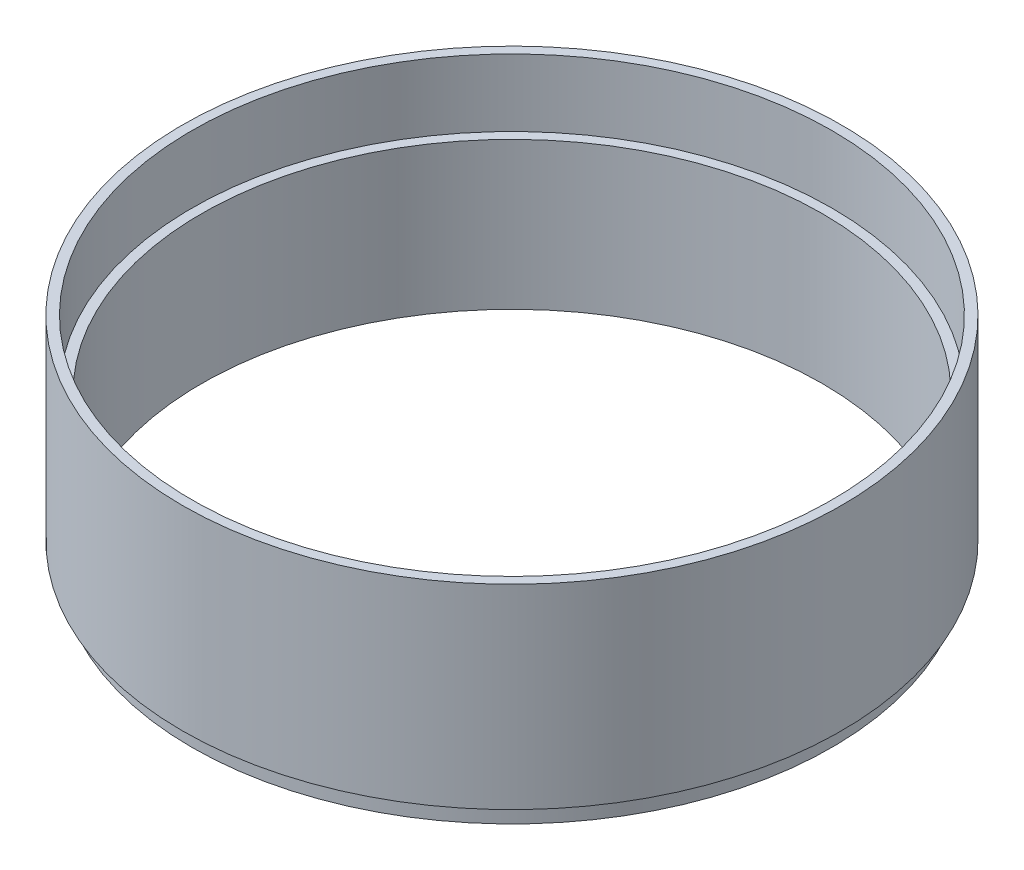
ISO-10303-21;
HEADER;
FILE_DESCRIPTION(('STEP AP214'),'2;1');
FILE_NAME('part.step','',(''),(''),'','','');
FILE_SCHEMA(('AUTOMOTIVE_DESIGN { 1 0 10303 214 1 1 1 1 }'));
ENDSEC;
DATA;
#1=APPLICATION_CONTEXT('core data for automotive mechanical design processes');
#2=APPLICATION_PROTOCOL_DEFINITION('international standard','automotive_design',2000,#1);
#3=PRODUCT_CONTEXT('',#1,'mechanical');
#4=PRODUCT('Part','Part','',(#3));
#5=PRODUCT_RELATED_PRODUCT_CATEGORY('part','',(#4));
#6=PRODUCT_DEFINITION_FORMATION('','',#4);
#7=PRODUCT_DEFINITION_CONTEXT('part definition',#1,'design');
#8=PRODUCT_DEFINITION('design','',#6,#7);
#9=PRODUCT_DEFINITION_SHAPE('','',#8);
#10=(LENGTH_UNIT() NAMED_UNIT(*) SI_UNIT(.MILLI.,.METRE.));
#11=(NAMED_UNIT(*) PLANE_ANGLE_UNIT() SI_UNIT($,.RADIAN.));
#12=(NAMED_UNIT(*) SI_UNIT($,.STERADIAN.) SOLID_ANGLE_UNIT());
#13=UNCERTAINTY_MEASURE_WITH_UNIT(LENGTH_MEASURE(1.E-05),#10,'distance_accuracy_value','');
#14=(GEOMETRIC_REPRESENTATION_CONTEXT(3) GLOBAL_UNCERTAINTY_ASSIGNED_CONTEXT((#13)) GLOBAL_UNIT_ASSIGNED_CONTEXT((#10,
#11,#12)) REPRESENTATION_CONTEXT('',''));
#15=CARTESIAN_POINT('',(0.,0.,0.));
#16=DIRECTION('',(0.,0.,1.));
#17=DIRECTION('',(1.,0.,0.));
#18=AXIS2_PLACEMENT_3D('',#15,#16,#17);
#19=CARTESIAN_POINT('',(0.,46.,0.));
#20=DIRECTION('',(0.,1.,0.));
#21=DIRECTION('',(0.,0.,1.));
#22=AXIS2_PLACEMENT_3D('',#19,#20,#21);
#23=PLANE('',#22);
#24=CARTESIAN_POINT('',(0.,46.,0.));
#25=DIRECTION('',(0.,1.,0.));
#26=DIRECTION('',(0.,0.,1.));
#27=AXIS2_PLACEMENT_3D('',#24,#25,#26);
#28=CIRCLE('',#27,97.);
#29=CARTESIAN_POINT('',(0.,46.,97.));
#30=VERTEX_POINT('',#29);
#31=EDGE_CURVE('E65',#30,#30,#28,.T.);
#32=ORIENTED_EDGE('',*,*,#31,.F.);
#33=EDGE_LOOP('',(#32));
#34=FACE_BOUND('',#33,.T.);
#35=CARTESIAN_POINT('',(0.,46.,0.));
#36=DIRECTION('',(0.,1.,0.));
#37=DIRECTION('',(0.,0.,1.));
#38=AXIS2_PLACEMENT_3D('',#35,#36,#37);
#39=CIRCLE('',#38,100.);
#40=CARTESIAN_POINT('',(0.,46.,-100.));
#41=VERTEX_POINT('',#40);
#42=EDGE_CURVE('E74',#41,#41,#39,.T.);
#43=ORIENTED_EDGE('',*,*,#42,.T.);
#44=EDGE_LOOP('',(#43));
#45=FACE_BOUND('',#44,.T.);
#46=ADVANCED_FACE('F43',(#34,#45),#23,.T.);
#47=CARTESIAN_POINT('',(0.,0.,0.));
#48=DIRECTION('',(0.,1.,0.));
#49=DIRECTION('',(0.,0.,1.));
#50=AXIS2_PLACEMENT_3D('',#47,#48,#49);
#51=PLANE('',#50);
#52=CARTESIAN_POINT('',(0.,0.,0.));
#53=DIRECTION('',(0.,1.,0.));
#54=DIRECTION('',(0.,0.,1.));
#55=AXIS2_PLACEMENT_3D('',#52,#53,#54);
#56=CIRCLE('',#55,100.);
#57=CARTESIAN_POINT('',(0.,0.,100.));
#58=VERTEX_POINT('',#57);
#59=EDGE_CURVE('E47',#58,#58,#56,.T.);
#60=ORIENTED_EDGE('',*,*,#59,.F.);
#61=EDGE_LOOP('',(#60));
#62=FACE_BOUND('',#61,.T.);
#63=CARTESIAN_POINT('',(0.,0.,0.));
#64=DIRECTION('',(0.,1.,0.));
#65=DIRECTION('',(0.,0.,1.));
#66=AXIS2_PLACEMENT_3D('',#63,#64,#65);
#67=CIRCLE('',#66,97.);
#68=CARTESIAN_POINT('',(0.,0.,97.));
#69=VERTEX_POINT('',#68);
#70=EDGE_CURVE('E56',#69,#69,#67,.T.);
#71=ORIENTED_EDGE('',*,*,#70,.T.);
#72=EDGE_LOOP('',(#71));
#73=FACE_BOUND('',#72,.T.);
#74=ADVANCED_FACE('F100',(#62,#73),#51,.F.);
#75=CARTESIAN_POINT('',(0.,6.,0.));
#76=DIRECTION('',(0.,-1.,0.));
#77=DIRECTION('',(0.,0.,-1.));
#78=AXIS2_PLACEMENT_3D('',#75,#76,#77);
#79=CYLINDRICAL_SURFACE('',#78,100.);
#80=CARTESIAN_POINT('',(0.,6.,0.));
#81=DIRECTION('',(0.,1.,0.));
#82=DIRECTION('',(0.,0.,1.));
#83=AXIS2_PLACEMENT_3D('',#80,#81,#82);
#84=CIRCLE('',#83,100.);
#85=CARTESIAN_POINT('',(0.,6.,100.));
#86=VERTEX_POINT('',#85);
#87=EDGE_CURVE('E10',#86,#86,#84,.T.);
#88=ORIENTED_EDGE('',*,*,#87,.F.);
#89=EDGE_LOOP('',(#88));
#90=FACE_BOUND('',#89,.T.);
#91=ORIENTED_EDGE('',*,*,#59,.T.);
#92=EDGE_LOOP('',(#91));
#93=FACE_BOUND('',#92,.T.);
#94=ADVANCED_FACE('F45',(#90,#93),#79,.T.);
#95=CARTESIAN_POINT('',(0.,6.,0.));
#96=DIRECTION('',(0.,-1.,0.));
#97=DIRECTION('',(0.,0.,-1.));
#98=AXIS2_PLACEMENT_3D('',#95,#96,#97);
#99=CYLINDRICAL_SURFACE('',#98,97.);
#100=ORIENTED_EDGE('',*,*,#70,.F.);
#101=EDGE_LOOP('',(#100));
#102=FACE_BOUND('',#101,.T.);
#103=ORIENTED_EDGE('',*,*,#31,.T.);
#104=EDGE_LOOP('',(#103));
#105=FACE_BOUND('',#104,.T.);
#106=ADVANCED_FACE('F110',(#102,#105),#99,.F.);
#107=CARTESIAN_POINT('',(0.,6.,0.));
#108=DIRECTION('',(0.,1.,0.));
#109=DIRECTION('',(0.,0.,1.));
#110=AXIS2_PLACEMENT_3D('',#107,#108,#109);
#111=PLANE('',#110);
#112=ORIENTED_EDGE('',*,*,#87,.T.);
#113=EDGE_LOOP('',(#112));
#114=FACE_BOUND('',#113,.T.);
#115=CARTESIAN_POINT('',(0.,6.,0.));
#116=DIRECTION('',(0.,1.,0.));
#117=DIRECTION('',(0.,0.,1.));
#118=AXIS2_PLACEMENT_3D('',#115,#116,#117);
#119=CIRCLE('',#118,103.);
#120=CARTESIAN_POINT('',(0.,6.,103.));
#121=VERTEX_POINT('',#120);
#122=EDGE_CURVE('E61',#121,#121,#119,.T.);
#123=ORIENTED_EDGE('',*,*,#122,.F.);
#124=EDGE_LOOP('',(#123));
#125=FACE_BOUND('',#124,.T.);
#126=ADVANCED_FACE('F95',(#114,#125),#111,.F.);
#127=CARTESIAN_POINT('',(0.,46.,0.));
#128=DIRECTION('',(0.,-1.,0.));
#129=DIRECTION('',(0.,0.,-1.));
#130=AXIS2_PLACEMENT_3D('',#127,#128,#129);
#131=CYLINDRICAL_SURFACE('',#130,103.);
#132=ORIENTED_EDGE('',*,*,#122,.T.);
#133=EDGE_LOOP('',(#132));
#134=FACE_BOUND('',#133,.T.);
#135=CARTESIAN_POINT('',(0.,67.,0.));
#136=DIRECTION('',(0.,1.,0.));
#137=DIRECTION('',(0.,0.,1.));
#138=AXIS2_PLACEMENT_3D('',#135,#136,#137);
#139=CIRCLE('',#138,103.);
#140=CARTESIAN_POINT('',(0.,67.,103.));
#141=VERTEX_POINT('',#140);
#142=EDGE_CURVE('E69',#141,#141,#139,.T.);
#143=ORIENTED_EDGE('',*,*,#142,.F.);
#144=EDGE_LOOP('',(#143));
#145=FACE_BOUND('',#144,.T.);
#146=ADVANCED_FACE('F87',(#134,#145),#131,.T.);
#147=CARTESIAN_POINT('',(0.,67.,0.));
#148=DIRECTION('',(0.,1.,0.));
#149=DIRECTION('',(0.,0.,1.));
#150=AXIS2_PLACEMENT_3D('',#147,#148,#149);
#151=PLANE('',#150);
#152=ORIENTED_EDGE('',*,*,#142,.T.);
#153=EDGE_LOOP('',(#152));
#154=FACE_BOUND('',#153,.T.);
#155=CARTESIAN_POINT('',(0.,67.,0.));
#156=DIRECTION('',(0.,1.,0.));
#157=DIRECTION('',(0.,0.,1.));
#158=AXIS2_PLACEMENT_3D('',#155,#156,#157);
#159=CIRCLE('',#158,100.);
#160=CARTESIAN_POINT('',(0.,67.,-100.));
#161=VERTEX_POINT('',#160);
#162=EDGE_CURVE('E73',#161,#161,#159,.T.);
#163=ORIENTED_EDGE('',*,*,#162,.F.);
#164=EDGE_LOOP('',(#163));
#165=FACE_BOUND('',#164,.T.);
#166=ADVANCED_FACE('F85',(#154,#165),#151,.T.);
#167=CARTESIAN_POINT('',(0.,67.,0.));
#168=DIRECTION('',(0.,-1.,0.));
#169=DIRECTION('',(0.,0.,-1.));
#170=AXIS2_PLACEMENT_3D('',#167,#168,#169);
#171=CYLINDRICAL_SURFACE('',#170,100.);
#172=CARTESIAN_POINT('',(0.,67.,-100.));
#173=CARTESIAN_POINT('',(0.,66.78125,-100.));
#174=CARTESIAN_POINT('',(0.,66.5625,-100.));
#175=CARTESIAN_POINT('',(0.,66.125,-100.));
#176=CARTESIAN_POINT('',(0.,65.90625,-100.));
#177=CARTESIAN_POINT('',(0.,65.46875,-100.));
#178=CARTESIAN_POINT('',(0.,65.25,-100.));
#179=CARTESIAN_POINT('',(0.,64.8125,-100.));
#180=CARTESIAN_POINT('',(0.,64.59375,-100.));
#181=CARTESIAN_POINT('',(0.,64.15625,-100.));
#182=CARTESIAN_POINT('',(0.,63.9375,-100.));
#183=CARTESIAN_POINT('',(0.,63.5,-100.));
#184=CARTESIAN_POINT('',(0.,63.28125,-100.));
#185=CARTESIAN_POINT('',(0.,62.84375,-100.));
#186=CARTESIAN_POINT('',(0.,62.625,-100.));
#187=CARTESIAN_POINT('',(0.,62.1875,-100.));
#188=CARTESIAN_POINT('',(0.,61.96875,-100.));
#189=CARTESIAN_POINT('',(0.,61.53125,-100.));
#190=CARTESIAN_POINT('',(0.,61.3125,-100.));
#191=CARTESIAN_POINT('',(0.,60.875,-100.));
#192=CARTESIAN_POINT('',(0.,60.65625,-100.));
#193=CARTESIAN_POINT('',(0.,60.21875,-100.));
#194=CARTESIAN_POINT('',(0.,60.,-100.));
#195=CARTESIAN_POINT('',(0.,59.5625,-100.));
#196=CARTESIAN_POINT('',(0.,59.34375,-100.));
#197=CARTESIAN_POINT('',(0.,58.90625,-100.));
#198=CARTESIAN_POINT('',(0.,58.6875,-100.));
#199=CARTESIAN_POINT('',(0.,58.25,-100.));
#200=CARTESIAN_POINT('',(0.,58.03125,-100.));
#201=CARTESIAN_POINT('',(0.,57.59375,-100.));
#202=CARTESIAN_POINT('',(0.,57.375,-100.));
#203=CARTESIAN_POINT('',(0.,56.9375,-100.));
#204=CARTESIAN_POINT('',(0.,56.71875,-100.));
#205=CARTESIAN_POINT('',(0.,56.28125,-100.));
#206=CARTESIAN_POINT('',(0.,56.0625,-100.));
#207=CARTESIAN_POINT('',(0.,55.625,-100.));
#208=CARTESIAN_POINT('',(0.,55.40625,-100.));
#209=CARTESIAN_POINT('',(0.,54.96875,-100.));
#210=CARTESIAN_POINT('',(0.,54.75,-100.));
#211=CARTESIAN_POINT('',(0.,54.3125,-100.));
#212=CARTESIAN_POINT('',(0.,54.09375,-100.));
#213=CARTESIAN_POINT('',(0.,53.65625,-100.));
#214=CARTESIAN_POINT('',(0.,53.4375,-100.));
#215=CARTESIAN_POINT('',(0.,53.,-100.));
#216=CARTESIAN_POINT('',(0.,52.78125,-100.));
#217=CARTESIAN_POINT('',(0.,52.34375,-100.));
#218=CARTESIAN_POINT('',(0.,52.125,-100.));
#219=CARTESIAN_POINT('',(0.,51.6875,-100.));
#220=CARTESIAN_POINT('',(0.,51.46875,-100.));
#221=CARTESIAN_POINT('',(0.,51.03125,-100.));
#222=CARTESIAN_POINT('',(0.,50.8125,-100.));
#223=CARTESIAN_POINT('',(0.,50.375,-100.));
#224=CARTESIAN_POINT('',(0.,50.15625,-100.));
#225=CARTESIAN_POINT('',(0.,49.71875,-100.));
#226=CARTESIAN_POINT('',(0.,49.5,-100.));
#227=CARTESIAN_POINT('',(0.,49.0625,-100.));
#228=CARTESIAN_POINT('',(0.,48.84375,-100.));
#229=CARTESIAN_POINT('',(0.,48.40625,-100.));
#230=CARTESIAN_POINT('',(0.,48.1875,-100.));
#231=CARTESIAN_POINT('',(0.,47.75,-100.));
#232=CARTESIAN_POINT('',(0.,47.53125,-100.));
#233=CARTESIAN_POINT('',(0.,47.09375,-100.));
#234=CARTESIAN_POINT('',(0.,46.875,-100.));
#235=CARTESIAN_POINT('',(0.,46.4375,-100.));
#236=CARTESIAN_POINT('',(0.,46.21875,-100.));
#237=CARTESIAN_POINT('',(0.,46.,-100.));
#238=B_SPLINE_CURVE_WITH_KNOTS('',3,(#172,#173,#174,#175,#176,#177,#178,#179,#180,#181,#182,
#183,#184,#185,#186,#187,#188,#189,#190,#191,#192,#193,#194,#195,#196,#197,#198,#199,#200,#201,
#202,#203,#204,#205,#206,#207,#208,#209,#210,#211,#212,#213,#214,#215,#216,#217,#218,#219,#220,
#221,#222,#223,#224,#225,#226,#227,#228,#229,#230,#231,#232,#233,#234,#235,#236,#237),
.UNSPECIFIED.,.F.,.F.,(4,2,2,2,2,2,2,2,2,2,2,2,2,2,2,2,2,2,2,2,2,2,2,2,2,2,2,2,2,2,2,2,4),(0.,
0.656250000000011,1.31250000000001,1.96875000000001,2.625,3.28125000000001,3.93750000000001,
4.59375000000001,5.25,5.90625000000001,6.56250000000001,7.21875000000001,7.87500000000001,
8.53125,9.18750000000001,9.84375000000001,10.5,11.15625,11.8125,12.46875,13.125,13.78125,
14.4375,15.09375,15.75,16.40625,17.0625,17.71875,18.375,19.03125,19.6875,20.34375,21.),.UNSPECIFIED.);
#239=EDGE_CURVE('BSEAM82',#161,#41,#238,.T.);
#240=ORIENTED_EDGE('',*,*,#162,.T.);
#241=ORIENTED_EDGE('',*,*,#42,.F.);
#242=ORIENTED_EDGE('',*,*,#239,.T.);
#243=ORIENTED_EDGE('',*,*,#239,.F.);
#244=EDGE_LOOP('',(#240,#242,#241,#243));
#245=FACE_BOUND('',#244,.T.);
#246=ADVANCED_FACE('F82',(#245),#171,.F.);
#247=CLOSED_SHELL('',(#46,#74,#94,#106,#126,#146,#166,#246));
#248=MANIFOLD_SOLID_BREP('B2',#247);
#249=ADVANCED_BREP_SHAPE_REPRESENTATION('',(#18,#248),#14);
#250=SHAPE_DEFINITION_REPRESENTATION(#9,#249);
ENDSEC;
END-ISO-10303-21;
